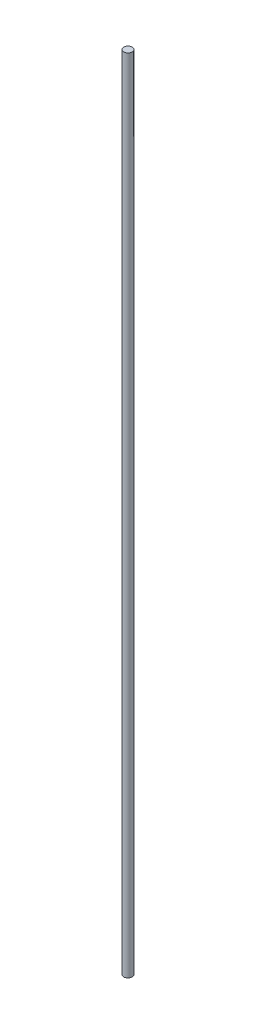
ISO-10303-21;
HEADER;
FILE_DESCRIPTION(('STEP AP214'),'2;1');
FILE_NAME('part.step','',(''),(''),'','','');
FILE_SCHEMA(('AUTOMOTIVE_DESIGN { 1 0 10303 214 1 1 1 1 }'));
ENDSEC;
DATA;
#1=APPLICATION_CONTEXT('core data for automotive mechanical design processes');
#2=APPLICATION_PROTOCOL_DEFINITION('international standard','automotive_design',2000,#1);
#3=PRODUCT_CONTEXT('',#1,'mechanical');
#4=PRODUCT('Part','Part','',(#3));
#5=PRODUCT_RELATED_PRODUCT_CATEGORY('part','',(#4));
#6=PRODUCT_DEFINITION_FORMATION('','',#4);
#7=PRODUCT_DEFINITION_CONTEXT('part definition',#1,'design');
#8=PRODUCT_DEFINITION('design','',#6,#7);
#9=PRODUCT_DEFINITION_SHAPE('','',#8);
#10=(LENGTH_UNIT() NAMED_UNIT(*) SI_UNIT(.MILLI.,.METRE.));
#11=(NAMED_UNIT(*) PLANE_ANGLE_UNIT() SI_UNIT($,.RADIAN.));
#12=(NAMED_UNIT(*) SI_UNIT($,.STERADIAN.) SOLID_ANGLE_UNIT());
#13=UNCERTAINTY_MEASURE_WITH_UNIT(LENGTH_MEASURE(1.E-05),#10,'distance_accuracy_value','');
#14=(GEOMETRIC_REPRESENTATION_CONTEXT(3) GLOBAL_UNCERTAINTY_ASSIGNED_CONTEXT((#13)) GLOBAL_UNIT_ASSIGNED_CONTEXT((#10,
#11,#12)) REPRESENTATION_CONTEXT('',''));
#15=CARTESIAN_POINT('',(0.,0.,0.));
#16=DIRECTION('',(0.,0.,1.));
#17=DIRECTION('',(1.,0.,0.));
#18=AXIS2_PLACEMENT_3D('',#15,#16,#17);
#19=CARTESIAN_POINT('',(0.,580.,0.));
#20=DIRECTION('',(0.,-1.,0.));
#21=DIRECTION('',(0.,0.,-1.));
#22=AXIS2_PLACEMENT_3D('',#19,#20,#21);
#23=CYLINDRICAL_SURFACE('',#22,3.1);
#24=CARTESIAN_POINT('',(0.,580.,0.));
#25=DIRECTION('',(0.,1.,0.));
#26=DIRECTION('',(0.,0.,1.));
#27=AXIS2_PLACEMENT_3D('',#24,#25,#26);
#28=CIRCLE('',#27,3.1);
#29=CARTESIAN_POINT('',(0.,580.,3.1));
#30=VERTEX_POINT('',#29);
#31=EDGE_CURVE('E10',#30,#30,#28,.T.);
#32=ORIENTED_EDGE('',*,*,#31,.F.);
#33=EDGE_LOOP('',(#32));
#34=FACE_BOUND('',#33,.T.);
#35=CARTESIAN_POINT('',(0.,0.,0.));
#36=DIRECTION('',(0.,1.,0.));
#37=DIRECTION('',(0.,0.,1.));
#38=AXIS2_PLACEMENT_3D('',#35,#36,#37);
#39=CIRCLE('',#38,3.1);
#40=CARTESIAN_POINT('',(0.,0.,3.1));
#41=VERTEX_POINT('',#40);
#42=EDGE_CURVE('E38',#41,#41,#39,.T.);
#43=ORIENTED_EDGE('',*,*,#42,.T.);
#44=EDGE_LOOP('',(#43));
#45=FACE_BOUND('',#44,.T.);
#46=ADVANCED_FACE('F35',(#34,#45),#23,.T.);
#47=CARTESIAN_POINT('',(0.,580.,0.));
#48=DIRECTION('',(0.,1.,0.));
#49=DIRECTION('',(0.,0.,1.));
#50=AXIS2_PLACEMENT_3D('',#47,#48,#49);
#51=PLANE('',#50);
#52=ORIENTED_EDGE('',*,*,#31,.T.);
#53=EDGE_LOOP('',(#52));
#54=FACE_BOUND('',#53,.T.);
#55=ADVANCED_FACE('F50',(#54),#51,.T.);
#56=CARTESIAN_POINT('',(0.,0.,0.));
#57=DIRECTION('',(0.,1.,0.));
#58=DIRECTION('',(0.,0.,1.));
#59=AXIS2_PLACEMENT_3D('',#56,#57,#58);
#60=PLANE('',#59);
#61=ORIENTED_EDGE('',*,*,#42,.F.);
#62=EDGE_LOOP('',(#61));
#63=FACE_BOUND('',#62,.T.);
#64=ADVANCED_FACE('F48',(#63),#60,.F.);
#65=CLOSED_SHELL('',(#46,#55,#64));
#66=MANIFOLD_SOLID_BREP('B2',#65);
#67=ADVANCED_BREP_SHAPE_REPRESENTATION('',(#18,#66),#14);
#68=SHAPE_DEFINITION_REPRESENTATION(#9,#67);
ENDSEC;
END-ISO-10303-21;
